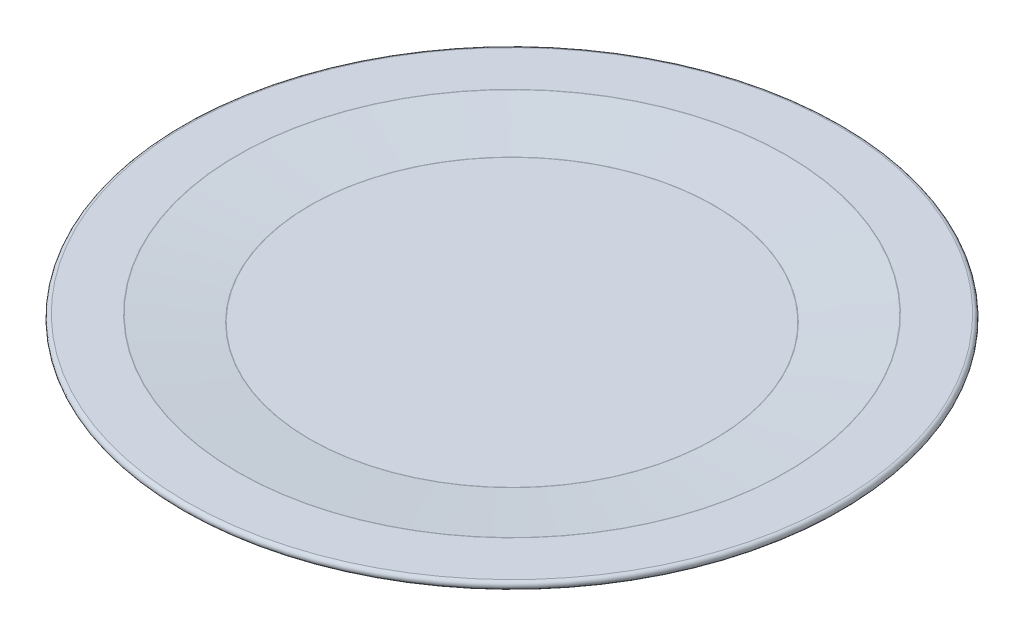
ISO-10303-21;
HEADER;
FILE_DESCRIPTION(('STEP AP214'),'2;1');
FILE_NAME('part.step','',(''),(''),'','','');
FILE_SCHEMA(('AUTOMOTIVE_DESIGN { 1 0 10303 214 1 1 1 1 }'));
ENDSEC;
DATA;
#1=APPLICATION_CONTEXT('core data for automotive mechanical design processes');
#2=APPLICATION_PROTOCOL_DEFINITION('international standard','automotive_design',2000,#1);
#3=PRODUCT_CONTEXT('',#1,'mechanical');
#4=PRODUCT('Part','Part','',(#3));
#5=PRODUCT_RELATED_PRODUCT_CATEGORY('part','',(#4));
#6=PRODUCT_DEFINITION_FORMATION('','',#4);
#7=PRODUCT_DEFINITION_CONTEXT('part definition',#1,'design');
#8=PRODUCT_DEFINITION('design','',#6,#7);
#9=PRODUCT_DEFINITION_SHAPE('','',#8);
#10=(LENGTH_UNIT() NAMED_UNIT(*) SI_UNIT(.MILLI.,.METRE.));
#11=(NAMED_UNIT(*) PLANE_ANGLE_UNIT() SI_UNIT($,.RADIAN.));
#12=(NAMED_UNIT(*) SI_UNIT($,.STERADIAN.) SOLID_ANGLE_UNIT());
#13=UNCERTAINTY_MEASURE_WITH_UNIT(LENGTH_MEASURE(1.E-05),#10,'distance_accuracy_value','');
#14=(GEOMETRIC_REPRESENTATION_CONTEXT(3) GLOBAL_UNCERTAINTY_ASSIGNED_CONTEXT((#13)) GLOBAL_UNIT_ASSIGNED_CONTEXT((#10,
#11,#12)) REPRESENTATION_CONTEXT('',''));
#15=CARTESIAN_POINT('',(0.,0.,0.));
#16=DIRECTION('',(0.,0.,1.));
#17=DIRECTION('',(1.,0.,0.));
#18=AXIS2_PLACEMENT_3D('',#15,#16,#17);
#19=CARTESIAN_POINT('',(0.,2.26673706659012,0.));
#20=DIRECTION('',(0.,1.,0.));
#21=DIRECTION('',(0.,0.,1.));
#22=AXIS2_PLACEMENT_3D('',#19,#20,#21);
#23=CONICAL_SURFACE('',#22,118.2624,1.11701072126637);
#24=CARTESIAN_POINT('',(0.,6.85118780383347,0.));
#25=DIRECTION('',(0.,1.,0.));
#26=DIRECTION('',(0.,0.,1.));
#27=AXIS2_PLACEMENT_3D('',#24,#25,#26);
#28=CIRCLE('',#27,127.661916957863);
#29=CARTESIAN_POINT('',(0.,6.85118780383347,127.661916957863));
#30=VERTEX_POINT('',#29);
#31=EDGE_CURVE('E10',#30,#30,#28,.F.);
#32=ORIENTED_EDGE('',*,*,#31,.T.);
#33=EDGE_LOOP('',(#32));
#34=FACE_BOUND('',#33,.T.);
#35=CARTESIAN_POINT('',(0.,2.26673706659012,0.));
#36=DIRECTION('',(0.,1.,0.));
#37=DIRECTION('',(0.,0.,1.));
#38=AXIS2_PLACEMENT_3D('',#35,#36,#37);
#39=CIRCLE('',#38,118.2624);
#40=CARTESIAN_POINT('',(0.,2.26673706659012,118.2624));
#41=VERTEX_POINT('',#40);
#42=EDGE_CURVE('E78',#41,#41,#39,.T.);
#43=ORIENTED_EDGE('',*,*,#42,.T.);
#44=EDGE_LOOP('',(#43));
#45=FACE_BOUND('',#44,.T.);
#46=ADVANCED_FACE('F46',(#34,#45),#23,.T.);
#47=CARTESIAN_POINT('',(0.,9.65813706659011,0.));
#48=DIRECTION('',(0.,1.,0.));
#49=DIRECTION('',(0.,0.,1.));
#50=AXIS2_PLACEMENT_3D('',#47,#48,#49);
#51=PLANE('',#50);
#52=CARTESIAN_POINT('',(0.,9.65813706659011,0.));
#53=DIRECTION('',(0.,1.,0.));
#54=DIRECTION('',(0.,0.,1.));
#55=AXIS2_PLACEMENT_3D('',#52,#53,#54);
#56=CIRCLE('',#55,127.013881658974);
#57=CARTESIAN_POINT('',(0.,9.65813706659011,127.013881658974));
#58=VERTEX_POINT('',#57);
#59=EDGE_CURVE('E54',#58,#58,#56,.T.);
#60=ORIENTED_EDGE('',*,*,#59,.T.);
#61=EDGE_LOOP('',(#60));
#62=FACE_BOUND('',#61,.T.);
#63=CARTESIAN_POINT('',(0.,9.65813706659011,0.));
#64=DIRECTION('',(0.,1.,0.));
#65=DIRECTION('',(0.,0.,1.));
#66=AXIS2_PLACEMENT_3D('',#63,#64,#65);
#67=CIRCLE('',#66,107.090526446082);
#68=CARTESIAN_POINT('',(0.,9.65813706659011,107.090526446082));
#69=VERTEX_POINT('',#68);
#70=EDGE_CURVE('E59',#69,#69,#67,.F.);
#71=ORIENTED_EDGE('',*,*,#70,.T.);
#72=EDGE_LOOP('',(#71));
#73=FACE_BOUND('',#72,.T.);
#74=ADVANCED_FACE('F87',(#62,#73),#51,.T.);
#75=CARTESIAN_POINT('',(0.,2.26673706659012,0.));
#76=DIRECTION('',(0.,1.,0.));
#77=DIRECTION('',(0.,0.,1.));
#78=AXIS2_PLACEMENT_3D('',#75,#76,#77);
#79=PLANE('',#78);
#80=ORIENTED_EDGE('',*,*,#42,.F.);
#81=EDGE_LOOP('',(#80));
#82=FACE_BOUND('',#81,.T.);
#83=ADVANCED_FACE('F84',(#82),#79,.F.);
#84=CARTESIAN_POINT('',(0.,9.65813706659011,0.));
#85=DIRECTION('',(0.,1.,0.));
#86=DIRECTION('',(0.,0.,1.));
#87=AXIS2_PLACEMENT_3D('',#84,#85,#86);
#88=CONICAL_SURFACE('',#87,107.013053074116,1.46607657166524);
#89=CARTESIAN_POINT('',(0.,6.70967523910665,0.));
#90=DIRECTION('',(0.,-1.,0.));
#91=DIRECTION('',(0.,0.,-1.));
#92=AXIS2_PLACEMENT_3D('',#89,#90,#91);
#93=CIRCLE('',#92,78.9603126707728);
#94=CARTESIAN_POINT('',(0.,6.70967523910665,-78.9603126707728));
#95=VERTEX_POINT('',#94);
#96=EDGE_CURVE('E64',#95,#95,#93,.T.);
#97=ORIENTED_EDGE('',*,*,#96,.T.);
#98=EDGE_LOOP('',(#97));
#99=FACE_BOUND('',#98,.T.);
#100=CARTESIAN_POINT('',(0.,9.6500388940736,0.));
#101=DIRECTION('',(0.,1.,0.));
#102=DIRECTION('',(0.,0.,1.));
#103=AXIS2_PLACEMENT_3D('',#100,#101,#102);
#104=CIRCLE('',#103,106.936004109388);
#105=CARTESIAN_POINT('',(0.,9.6500388940736,106.936004109388));
#106=VERTEX_POINT('',#105);
#107=EDGE_CURVE('E70',#106,#106,#104,.T.);
#108=ORIENTED_EDGE('',*,*,#107,.T.);
#109=EDGE_LOOP('',(#108));
#110=FACE_BOUND('',#109,.T.);
#111=ADVANCED_FACE('F86',(#99,#110),#88,.F.);
#112=CARTESIAN_POINT('',(0.,6.70157706659012,0.));
#113=DIRECTION('',(0.,1.,0.));
#114=DIRECTION('',(0.,0.,1.));
#115=AXIS2_PLACEMENT_3D('',#112,#113,#114);
#116=PLANE('',#115);
#117=CARTESIAN_POINT('',(0.,6.70157706659012,0.));
#118=DIRECTION('',(0.,1.,0.));
#119=DIRECTION('',(0.,0.,1.));
#120=AXIS2_PLACEMENT_3D('',#117,#118,#119);
#121=CIRCLE('',#120,78.8057903340788);
#122=CARTESIAN_POINT('',(0.,6.70157706659012,78.8057903340788));
#123=VERTEX_POINT('',#122);
#124=EDGE_CURVE('E74',#123,#123,#121,.T.);
#125=ORIENTED_EDGE('',*,*,#124,.T.);
#126=EDGE_LOOP('',(#125));
#127=FACE_BOUND('',#126,.T.);
#128=ADVANCED_FACE('F93',(#127),#116,.T.);
#129=CARTESIAN_POINT('',(0.,8.17985706659011,0.));
#130=DIRECTION('',(0.,1.,0.));
#131=DIRECTION('',(0.,0.,1.));
#132=AXIS2_PLACEMENT_3D('',#129,#130,#131);
#133=TOROIDAL_SURFACE('',#132,78.8057903340788,1.47828);
#134=ORIENTED_EDGE('',*,*,#96,.F.);
#135=EDGE_LOOP('',(#134));
#136=FACE_BOUND('',#135,.T.);
#137=ORIENTED_EDGE('',*,*,#124,.F.);
#138=EDGE_LOOP('',(#137));
#139=FACE_BOUND('',#138,.T.);
#140=ADVANCED_FACE('F102',(#136,#139),#133,.F.);
#141=CARTESIAN_POINT('',(0.,8.17985706659011,0.));
#142=DIRECTION('',(0.,1.,0.));
#143=DIRECTION('',(0.,0.,1.));
#144=AXIS2_PLACEMENT_3D('',#141,#142,#143);
#145=TOROIDAL_SURFACE('',#144,127.013881658974,1.47828);
#146=ORIENTED_EDGE('',*,*,#31,.F.);
#147=EDGE_LOOP('',(#146));
#148=FACE_BOUND('',#147,.T.);
#149=ORIENTED_EDGE('',*,*,#59,.F.);
#150=EDGE_LOOP('',(#149));
#151=FACE_BOUND('',#150,.T.);
#152=ADVANCED_FACE('F104',(#148,#151),#145,.T.);
#153=CARTESIAN_POINT('',(0.,8.17985706659011,0.));
#154=DIRECTION('',(0.,1.,0.));
#155=DIRECTION('',(0.,0.,1.));
#156=AXIS2_PLACEMENT_3D('',#153,#154,#155);
#157=TOROIDAL_SURFACE('',#156,107.090526446082,1.47828);
#158=ORIENTED_EDGE('',*,*,#70,.F.);
#159=EDGE_LOOP('',(#158));
#160=FACE_BOUND('',#159,.T.);
#161=ORIENTED_EDGE('',*,*,#107,.F.);
#162=EDGE_LOOP('',(#161));
#163=FACE_BOUND('',#162,.T.);
#164=ADVANCED_FACE('F48',(#160,#163),#157,.T.);
#165=CLOSED_SHELL('',(#46,#74,#83,#111,#128,#140,#152,#164));
#166=MANIFOLD_SOLID_BREP('B2',#165);
#167=ADVANCED_BREP_SHAPE_REPRESENTATION('',(#18,#166),#14);
#168=SHAPE_DEFINITION_REPRESENTATION(#9,#167);
ENDSEC;
END-ISO-10303-21;
